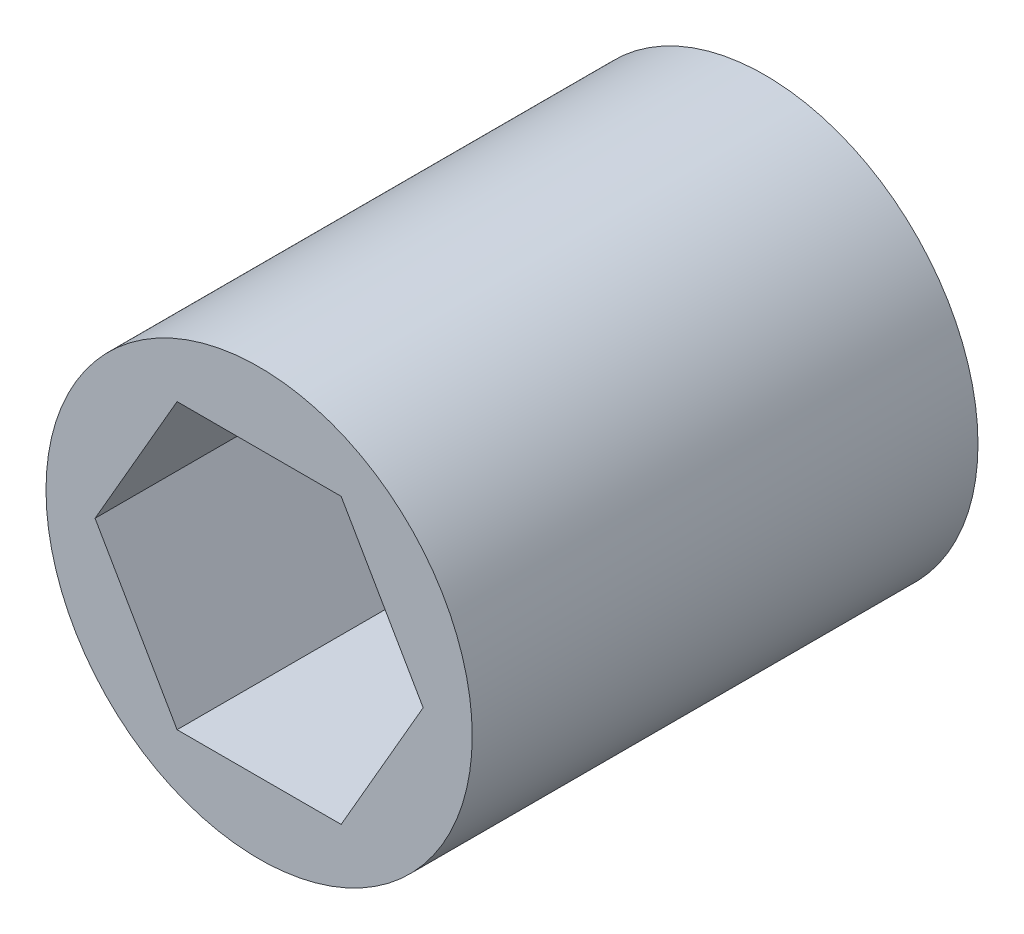
ISO-10303-21;
HEADER;
FILE_DESCRIPTION(('STEP AP214'),'2;1');
FILE_NAME('part.step','',(''),(''),'','','');
FILE_SCHEMA(('AUTOMOTIVE_DESIGN { 1 0 10303 214 1 1 1 1 }'));
ENDSEC;
DATA;
#1=APPLICATION_CONTEXT('core data for automotive mechanical design processes');
#2=APPLICATION_PROTOCOL_DEFINITION('international standard','automotive_design',2000,#1);
#3=PRODUCT_CONTEXT('',#1,'mechanical');
#4=PRODUCT('Part','Part','',(#3));
#5=PRODUCT_RELATED_PRODUCT_CATEGORY('part','',(#4));
#6=PRODUCT_DEFINITION_FORMATION('','',#4);
#7=PRODUCT_DEFINITION_CONTEXT('part definition',#1,'design');
#8=PRODUCT_DEFINITION('design','',#6,#7);
#9=PRODUCT_DEFINITION_SHAPE('','',#8);
#10=(LENGTH_UNIT() NAMED_UNIT(*) SI_UNIT(.MILLI.,.METRE.));
#11=(NAMED_UNIT(*) PLANE_ANGLE_UNIT() SI_UNIT($,.RADIAN.));
#12=(NAMED_UNIT(*) SI_UNIT($,.STERADIAN.) SOLID_ANGLE_UNIT());
#13=UNCERTAINTY_MEASURE_WITH_UNIT(LENGTH_MEASURE(1.E-05),#10,'distance_accuracy_value','');
#14=(GEOMETRIC_REPRESENTATION_CONTEXT(3) GLOBAL_UNCERTAINTY_ASSIGNED_CONTEXT((#13)) GLOBAL_UNIT_ASSIGNED_CONTEXT((#10,
#11,#12)) REPRESENTATION_CONTEXT('',''));
#15=CARTESIAN_POINT('',(0.,0.,0.));
#16=DIRECTION('',(0.,0.,1.));
#17=DIRECTION('',(1.,0.,0.));
#18=AXIS2_PLACEMENT_3D('',#15,#16,#17);
#19=CARTESIAN_POINT('',(0.,0.,22.606));
#20=DIRECTION('',(0.,0.,1.));
#21=DIRECTION('',(1.,0.,0.));
#22=AXIS2_PLACEMENT_3D('',#19,#20,#21);
#23=PLANE('',#22);
#24=CARTESIAN_POINT('',(0.,0.,22.606));
#25=DIRECTION('',(0.,0.,1.));
#26=DIRECTION('',(1.,0.,0.));
#27=AXIS2_PLACEMENT_3D('',#24,#25,#26);
#28=CIRCLE('',#27,9.525);
#29=CARTESIAN_POINT('',(-9.525,0.,22.606));
#30=VERTEX_POINT('',#29);
#31=EDGE_CURVE('E11',#30,#30,#28,.T.);
#32=ORIENTED_EDGE('',*,*,#31,.T.);
#33=EDGE_LOOP('',(#32));
#34=FACE_BOUND('',#33,.T.);
#35=DIRECTION('',(-1.,0.,0.));
#36=VECTOR('',#35,1.);
#37=CARTESIAN_POINT('',(3.66617420935412,6.35,22.606));
#38=LINE('',#37,#36);
#39=CARTESIAN_POINT('',(3.66617420935412,6.35,22.606));
#40=VERTEX_POINT('',#39);
#41=CARTESIAN_POINT('',(-3.66617420935412,6.35,22.606));
#42=VERTEX_POINT('',#41);
#43=EDGE_CURVE('E97',#40,#42,#38,.T.);
#44=ORIENTED_EDGE('',*,*,#43,.F.);
#45=DIRECTION('',(-0.5,0.866025403784439,0.));
#46=VECTOR('',#45,1.);
#47=CARTESIAN_POINT('',(7.33234841870825,0.,22.606));
#48=LINE('',#47,#46);
#49=CARTESIAN_POINT('',(7.33234841870825,0.,22.606));
#50=VERTEX_POINT('',#49);
#51=EDGE_CURVE('E89',#50,#40,#48,.T.);
#52=ORIENTED_EDGE('',*,*,#51,.F.);
#53=DIRECTION('',(0.5,0.866025403784439,0.));
#54=VECTOR('',#53,1.);
#55=CARTESIAN_POINT('',(3.66617420935412,-6.35,22.606));
#56=LINE('',#55,#54);
#57=CARTESIAN_POINT('',(3.66617420935412,-6.35,22.606));
#58=VERTEX_POINT('',#57);
#59=EDGE_CURVE('E117',#58,#50,#56,.T.);
#60=ORIENTED_EDGE('',*,*,#59,.F.);
#61=DIRECTION('',(1.,0.,0.));
#62=VECTOR('',#61,1.);
#63=CARTESIAN_POINT('',(-3.66617420935412,-6.35,22.606));
#64=LINE('',#63,#62);
#65=CARTESIAN_POINT('',(-3.66617420935412,-6.35,22.606));
#66=VERTEX_POINT('',#65);
#67=EDGE_CURVE('E115',#66,#58,#64,.T.);
#68=ORIENTED_EDGE('',*,*,#67,.F.);
#69=DIRECTION('',(0.5,-0.866025403784438,0.));
#70=VECTOR('',#69,1.);
#71=CARTESIAN_POINT('',(-7.33234841870825,0.,22.606));
#72=LINE('',#71,#70);
#73=CARTESIAN_POINT('',(-7.33234841870825,0.,22.606));
#74=VERTEX_POINT('',#73);
#75=EDGE_CURVE('E111',#74,#66,#72,.T.);
#76=ORIENTED_EDGE('',*,*,#75,.F.);
#77=DIRECTION('',(-0.5,-0.866025403784439,0.));
#78=VECTOR('',#77,1.);
#79=CARTESIAN_POINT('',(-3.66617420935412,6.35,22.606));
#80=LINE('',#79,#78);
#81=EDGE_CURVE('E109',#42,#74,#80,.T.);
#82=ORIENTED_EDGE('',*,*,#81,.F.);
#83=EDGE_LOOP('',(#44,#52,#60,#68,#76,#82));
#84=FACE_BOUND('',#83,.T.);
#85=ADVANCED_FACE('F36',(#34,#84),#23,.T.);
#86=CARTESIAN_POINT('',(0.,0.,0.));
#87=DIRECTION('',(0.,0.,1.));
#88=DIRECTION('',(1.,0.,0.));
#89=AXIS2_PLACEMENT_3D('',#86,#87,#88);
#90=PLANE('',#89);
#91=CARTESIAN_POINT('',(0.,0.,0.));
#92=DIRECTION('',(0.,0.,1.));
#93=DIRECTION('',(1.,0.,0.));
#94=AXIS2_PLACEMENT_3D('',#91,#92,#93);
#95=CIRCLE('',#94,9.525);
#96=CARTESIAN_POINT('',(-9.525,0.,0.));
#97=VERTEX_POINT('',#96);
#98=EDGE_CURVE('E40',#97,#97,#95,.T.);
#99=ORIENTED_EDGE('',*,*,#98,.F.);
#100=EDGE_LOOP('',(#99));
#101=FACE_BOUND('',#100,.T.);
#102=DIRECTION('',(-0.5,0.866025403784439,0.));
#103=VECTOR('',#102,1.);
#104=CARTESIAN_POINT('',(7.33234841870825,0.,0.));
#105=LINE('',#104,#103);
#106=CARTESIAN_POINT('',(7.33234841870825,0.,0.));
#107=VERTEX_POINT('',#106);
#108=CARTESIAN_POINT('',(3.66617420935412,6.35,0.));
#109=VERTEX_POINT('',#108);
#110=EDGE_CURVE('E59',#107,#109,#105,.T.);
#111=ORIENTED_EDGE('',*,*,#110,.T.);
#112=DIRECTION('',(-1.,0.,0.));
#113=VECTOR('',#112,1.);
#114=CARTESIAN_POINT('',(3.66617420935412,6.35,0.));
#115=LINE('',#114,#113);
#116=CARTESIAN_POINT('',(-3.66617420935412,6.35,0.));
#117=VERTEX_POINT('',#116);
#118=EDGE_CURVE('E104',#109,#117,#115,.T.);
#119=ORIENTED_EDGE('',*,*,#118,.T.);
#120=DIRECTION('',(-0.5,-0.866025403784439,0.));
#121=VECTOR('',#120,1.);
#122=CARTESIAN_POINT('',(-3.66617420935412,6.35,0.));
#123=LINE('',#122,#121);
#124=CARTESIAN_POINT('',(-7.33234841870825,0.,0.));
#125=VERTEX_POINT('',#124);
#126=EDGE_CURVE('E121',#117,#125,#123,.T.);
#127=ORIENTED_EDGE('',*,*,#126,.T.);
#128=DIRECTION('',(0.5,-0.866025403784438,0.));
#129=VECTOR('',#128,1.);
#130=CARTESIAN_POINT('',(-7.33234841870825,0.,0.));
#131=LINE('',#130,#129);
#132=CARTESIAN_POINT('',(-3.66617420935412,-6.35,0.));
#133=VERTEX_POINT('',#132);
#134=EDGE_CURVE('E124',#125,#133,#131,.T.);
#135=ORIENTED_EDGE('',*,*,#134,.T.);
#136=DIRECTION('',(1.,0.,0.));
#137=VECTOR('',#136,1.);
#138=CARTESIAN_POINT('',(-3.66617420935412,-6.35,0.));
#139=LINE('',#138,#137);
#140=CARTESIAN_POINT('',(3.66617420935412,-6.35,0.));
#141=VERTEX_POINT('',#140);
#142=EDGE_CURVE('E127',#133,#141,#139,.T.);
#143=ORIENTED_EDGE('',*,*,#142,.T.);
#144=DIRECTION('',(0.5,0.866025403784439,0.));
#145=VECTOR('',#144,1.);
#146=CARTESIAN_POINT('',(3.66617420935412,-6.35,0.));
#147=LINE('',#146,#145);
#148=EDGE_CURVE('E98',#141,#107,#147,.T.);
#149=ORIENTED_EDGE('',*,*,#148,.T.);
#150=EDGE_LOOP('',(#111,#119,#127,#135,#143,#149));
#151=FACE_BOUND('',#150,.T.);
#152=ADVANCED_FACE('F144',(#101,#151),#90,.F.);
#153=CARTESIAN_POINT('',(0.,0.,22.606));
#154=DIRECTION('',(0.,0.,-1.));
#155=DIRECTION('',(-1.,0.,0.));
#156=AXIS2_PLACEMENT_3D('',#153,#154,#155);
#157=CYLINDRICAL_SURFACE('',#156,9.525);
#158=CARTESIAN_POINT('',(-9.525,0.,22.606));
#159=CARTESIAN_POINT('',(-9.525,0.,22.3705208333333));
#160=CARTESIAN_POINT('',(-9.525,0.,22.1350416666667));
#161=CARTESIAN_POINT('',(-9.525,0.,21.6640833333333));
#162=CARTESIAN_POINT('',(-9.525,0.,21.4286041666667));
#163=CARTESIAN_POINT('',(-9.525,0.,20.9576458333333));
#164=CARTESIAN_POINT('',(-9.525,0.,20.7221666666667));
#165=CARTESIAN_POINT('',(-9.525,0.,20.2512083333333));
#166=CARTESIAN_POINT('',(-9.525,0.,20.0157291666667));
#167=CARTESIAN_POINT('',(-9.525,0.,19.5447708333333));
#168=CARTESIAN_POINT('',(-9.525,0.,19.3092916666667));
#169=CARTESIAN_POINT('',(-9.525,0.,18.8383333333333));
#170=CARTESIAN_POINT('',(-9.525,0.,18.6028541666667));
#171=CARTESIAN_POINT('',(-9.525,0.,18.1318958333333));
#172=CARTESIAN_POINT('',(-9.525,0.,17.8964166666667));
#173=CARTESIAN_POINT('',(-9.525,0.,17.4254583333333));
#174=CARTESIAN_POINT('',(-9.525,0.,17.1899791666667));
#175=CARTESIAN_POINT('',(-9.525,0.,16.7190208333333));
#176=CARTESIAN_POINT('',(-9.525,0.,16.4835416666667));
#177=CARTESIAN_POINT('',(-9.525,0.,16.0125833333333));
#178=CARTESIAN_POINT('',(-9.525,0.,15.7771041666667));
#179=CARTESIAN_POINT('',(-9.525,0.,15.3061458333333));
#180=CARTESIAN_POINT('',(-9.525,0.,15.0706666666667));
#181=CARTESIAN_POINT('',(-9.525,0.,14.5997083333333));
#182=CARTESIAN_POINT('',(-9.525,0.,14.3642291666667));
#183=CARTESIAN_POINT('',(-9.525,0.,13.8932708333333));
#184=CARTESIAN_POINT('',(-9.525,0.,13.6577916666667));
#185=CARTESIAN_POINT('',(-9.525,0.,13.1868333333333));
#186=CARTESIAN_POINT('',(-9.525,0.,12.9513541666667));
#187=CARTESIAN_POINT('',(-9.525,0.,12.4803958333333));
#188=CARTESIAN_POINT('',(-9.525,0.,12.2449166666667));
#189=CARTESIAN_POINT('',(-9.525,0.,11.7739583333333));
#190=CARTESIAN_POINT('',(-9.525,0.,11.5384791666667));
#191=CARTESIAN_POINT('',(-9.525,0.,11.0675208333333));
#192=CARTESIAN_POINT('',(-9.525,0.,10.8320416666667));
#193=CARTESIAN_POINT('',(-9.525,0.,10.3610833333333));
#194=CARTESIAN_POINT('',(-9.525,0.,10.1256041666667));
#195=CARTESIAN_POINT('',(-9.525,0.,9.65464583333333));
#196=CARTESIAN_POINT('',(-9.525,0.,9.41916666666666));
#197=CARTESIAN_POINT('',(-9.525,0.,8.94820833333333));
#198=CARTESIAN_POINT('',(-9.525,0.,8.71272916666666));
#199=CARTESIAN_POINT('',(-9.525,0.,8.24177083333333));
#200=CARTESIAN_POINT('',(-9.525,0.,8.00629166666666));
#201=CARTESIAN_POINT('',(-9.525,0.,7.53533333333333));
#202=CARTESIAN_POINT('',(-9.525,0.,7.29985416666666));
#203=CARTESIAN_POINT('',(-9.525,0.,6.82889583333333));
#204=CARTESIAN_POINT('',(-9.525,0.,6.59341666666666));
#205=CARTESIAN_POINT('',(-9.525,0.,6.12245833333333));
#206=CARTESIAN_POINT('',(-9.525,0.,5.88697916666667));
#207=CARTESIAN_POINT('',(-9.525,0.,5.41602083333333));
#208=CARTESIAN_POINT('',(-9.525,0.,5.18054166666667));
#209=CARTESIAN_POINT('',(-9.525,0.,4.70958333333333));
#210=CARTESIAN_POINT('',(-9.525,0.,4.47410416666667));
#211=CARTESIAN_POINT('',(-9.525,0.,4.00314583333333));
#212=CARTESIAN_POINT('',(-9.525,0.,3.76766666666667));
#213=CARTESIAN_POINT('',(-9.525,0.,3.29670833333333));
#214=CARTESIAN_POINT('',(-9.525,0.,3.06122916666667));
#215=CARTESIAN_POINT('',(-9.525,0.,2.59027083333333));
#216=CARTESIAN_POINT('',(-9.525,0.,2.35479166666666));
#217=CARTESIAN_POINT('',(-9.525,0.,1.88383333333333));
#218=CARTESIAN_POINT('',(-9.525,0.,1.64835416666666));
#219=CARTESIAN_POINT('',(-9.525,0.,1.17739583333333));
#220=CARTESIAN_POINT('',(-9.525,0.,0.941916666666664));
#221=CARTESIAN_POINT('',(-9.525,0.,0.47095833333333));
#222=CARTESIAN_POINT('',(-9.525,0.,0.235479166666663));
#223=CARTESIAN_POINT('',(-9.525,0.,0.));
#224=B_SPLINE_CURVE_WITH_KNOTS('',3,(#158,#159,#160,#161,#162,#163,#164,#165,#166,#167,#168,
#169,#170,#171,#172,#173,#174,#175,#176,#177,#178,#179,#180,#181,#182,#183,#184,#185,#186,#187,
#188,#189,#190,#191,#192,#193,#194,#195,#196,#197,#198,#199,#200,#201,#202,#203,#204,#205,#206,
#207,#208,#209,#210,#211,#212,#213,#214,#215,#216,#217,#218,#219,#220,#221,#222,#223),
.UNSPECIFIED.,.F.,.F.,(4,2,2,2,2,2,2,2,2,2,2,2,2,2,2,2,2,2,2,2,2,2,2,2,2,2,2,2,2,2,2,2,4),(0.,
0.7064375,1.412875,2.1193125,2.82575,3.5321875,4.238625,4.9450625,5.6515,6.3579375,7.064375,
7.7708125,8.47725,9.1836875,9.890125,10.5965625,11.303,12.0094375,12.715875,13.4223125,14.12875,
14.8351875,15.541625,16.2480625,16.9545,17.6609375,18.367375,19.0738125,19.78025,20.4866875,
21.193125,21.8995625,22.606),.UNSPECIFIED.);
#225=EDGE_CURVE('BSEAM38',#30,#97,#224,.T.);
#226=ORIENTED_EDGE('',*,*,#31,.F.);
#227=ORIENTED_EDGE('',*,*,#98,.T.);
#228=ORIENTED_EDGE('',*,*,#225,.T.);
#229=ORIENTED_EDGE('',*,*,#225,.F.);
#230=EDGE_LOOP('',(#226,#228,#227,#229));
#231=FACE_BOUND('',#230,.T.);
#232=ADVANCED_FACE('F38',(#231),#157,.T.);
#233=CARTESIAN_POINT('',(7.33234841870825,0.,22.606));
#234=DIRECTION('',(-0.866025403784438,-0.5,0.));
#235=DIRECTION('',(0.5,-0.866025403784439,0.));
#236=AXIS2_PLACEMENT_3D('',#233,#234,#235);
#237=PLANE('',#236);
#238=ORIENTED_EDGE('',*,*,#110,.F.);
#239=DIRECTION('',(0.,0.,-1.));
#240=VECTOR('',#239,1.);
#241=CARTESIAN_POINT('',(7.33234841870825,0.,22.606));
#242=LINE('',#241,#240);
#243=EDGE_CURVE('E93',#50,#107,#242,.T.);
#244=ORIENTED_EDGE('',*,*,#243,.F.);
#245=ORIENTED_EDGE('',*,*,#51,.T.);
#246=DIRECTION('',(0.,0.,-1.));
#247=VECTOR('',#246,1.);
#248=CARTESIAN_POINT('',(3.66617420935412,6.35,22.606));
#249=LINE('',#248,#247);
#250=EDGE_CURVE('E92',#40,#109,#249,.T.);
#251=ORIENTED_EDGE('',*,*,#250,.T.);
#252=EDGE_LOOP('',(#238,#244,#245,#251));
#253=FACE_BOUND('',#252,.T.);
#254=ADVANCED_FACE('F91',(#253),#237,.T.);
#255=CARTESIAN_POINT('',(3.66617420935412,6.35,22.606));
#256=DIRECTION('',(0.,-1.,0.));
#257=DIRECTION('',(1.,0.,0.));
#258=AXIS2_PLACEMENT_3D('',#255,#256,#257);
#259=PLANE('',#258);
#260=ORIENTED_EDGE('',*,*,#118,.F.);
#261=ORIENTED_EDGE('',*,*,#250,.F.);
#262=ORIENTED_EDGE('',*,*,#43,.T.);
#263=DIRECTION('',(0.,0.,-1.));
#264=VECTOR('',#263,1.);
#265=CARTESIAN_POINT('',(-3.66617420935412,6.35,22.606));
#266=LINE('',#265,#264);
#267=EDGE_CURVE('E105',#42,#117,#266,.T.);
#268=ORIENTED_EDGE('',*,*,#267,.T.);
#269=EDGE_LOOP('',(#260,#261,#262,#268));
#270=FACE_BOUND('',#269,.T.);
#271=ADVANCED_FACE('F101',(#270),#259,.T.);
#272=CARTESIAN_POINT('',(-3.66617420935412,6.35,22.606));
#273=DIRECTION('',(0.866025403784439,-0.5,0.));
#274=DIRECTION('',(0.5,0.866025403784439,0.));
#275=AXIS2_PLACEMENT_3D('',#272,#273,#274);
#276=PLANE('',#275);
#277=ORIENTED_EDGE('',*,*,#126,.F.);
#278=ORIENTED_EDGE('',*,*,#267,.F.);
#279=ORIENTED_EDGE('',*,*,#81,.T.);
#280=DIRECTION('',(0.,0.,-1.));
#281=VECTOR('',#280,1.);
#282=CARTESIAN_POINT('',(-7.33234841870825,0.,22.606));
#283=LINE('',#282,#281);
#284=EDGE_CURVE('E136',#74,#125,#283,.T.);
#285=ORIENTED_EDGE('',*,*,#284,.T.);
#286=EDGE_LOOP('',(#277,#278,#279,#285));
#287=FACE_BOUND('',#286,.T.);
#288=ADVANCED_FACE('F140',(#287),#276,.T.);
#289=CARTESIAN_POINT('',(-7.33234841870825,0.,22.606));
#290=DIRECTION('',(0.866025403784438,0.5,0.));
#291=DIRECTION('',(-0.5,0.866025403784439,0.));
#292=AXIS2_PLACEMENT_3D('',#289,#290,#291);
#293=PLANE('',#292);
#294=ORIENTED_EDGE('',*,*,#134,.F.);
#295=ORIENTED_EDGE('',*,*,#284,.F.);
#296=ORIENTED_EDGE('',*,*,#75,.T.);
#297=DIRECTION('',(0.,0.,-1.));
#298=VECTOR('',#297,1.);
#299=CARTESIAN_POINT('',(-3.66617420935412,-6.35,22.606));
#300=LINE('',#299,#298);
#301=EDGE_CURVE('E134',#66,#133,#300,.T.);
#302=ORIENTED_EDGE('',*,*,#301,.T.);
#303=EDGE_LOOP('',(#294,#295,#296,#302));
#304=FACE_BOUND('',#303,.T.);
#305=ADVANCED_FACE('F152',(#304),#293,.T.);
#306=CARTESIAN_POINT('',(-3.66617420935412,-6.35,22.606));
#307=DIRECTION('',(0.,1.,0.));
#308=DIRECTION('',(0.,0.,1.));
#309=AXIS2_PLACEMENT_3D('',#306,#307,#308);
#310=PLANE('',#309);
#311=ORIENTED_EDGE('',*,*,#142,.F.);
#312=ORIENTED_EDGE('',*,*,#301,.F.);
#313=ORIENTED_EDGE('',*,*,#67,.T.);
#314=DIRECTION('',(0.,0.,-1.));
#315=VECTOR('',#314,1.);
#316=CARTESIAN_POINT('',(3.66617420935412,-6.35,22.606));
#317=LINE('',#316,#315);
#318=EDGE_CURVE('E51',#58,#141,#317,.T.);
#319=ORIENTED_EDGE('',*,*,#318,.T.);
#320=EDGE_LOOP('',(#311,#312,#313,#319));
#321=FACE_BOUND('',#320,.T.);
#322=ADVANCED_FACE('F150',(#321),#310,.T.);
#323=CARTESIAN_POINT('',(3.66617420935412,-6.35,22.606));
#324=DIRECTION('',(-0.866025403784439,0.5,0.));
#325=DIRECTION('',(-0.5,-0.866025403784439,0.));
#326=AXIS2_PLACEMENT_3D('',#323,#324,#325);
#327=PLANE('',#326);
#328=ORIENTED_EDGE('',*,*,#148,.F.);
#329=ORIENTED_EDGE('',*,*,#318,.F.);
#330=ORIENTED_EDGE('',*,*,#59,.T.);
#331=ORIENTED_EDGE('',*,*,#243,.T.);
#332=EDGE_LOOP('',(#328,#329,#330,#331));
#333=FACE_BOUND('',#332,.T.);
#334=ADVANCED_FACE('F146',(#333),#327,.T.);
#335=CLOSED_SHELL('',(#85,#152,#232,#254,#271,#288,#305,#322,#334));
#336=MANIFOLD_SOLID_BREP('B2',#335);
#337=ADVANCED_BREP_SHAPE_REPRESENTATION('',(#18,#336),#14);
#338=SHAPE_DEFINITION_REPRESENTATION(#9,#337);
ENDSEC;
END-ISO-10303-21;
